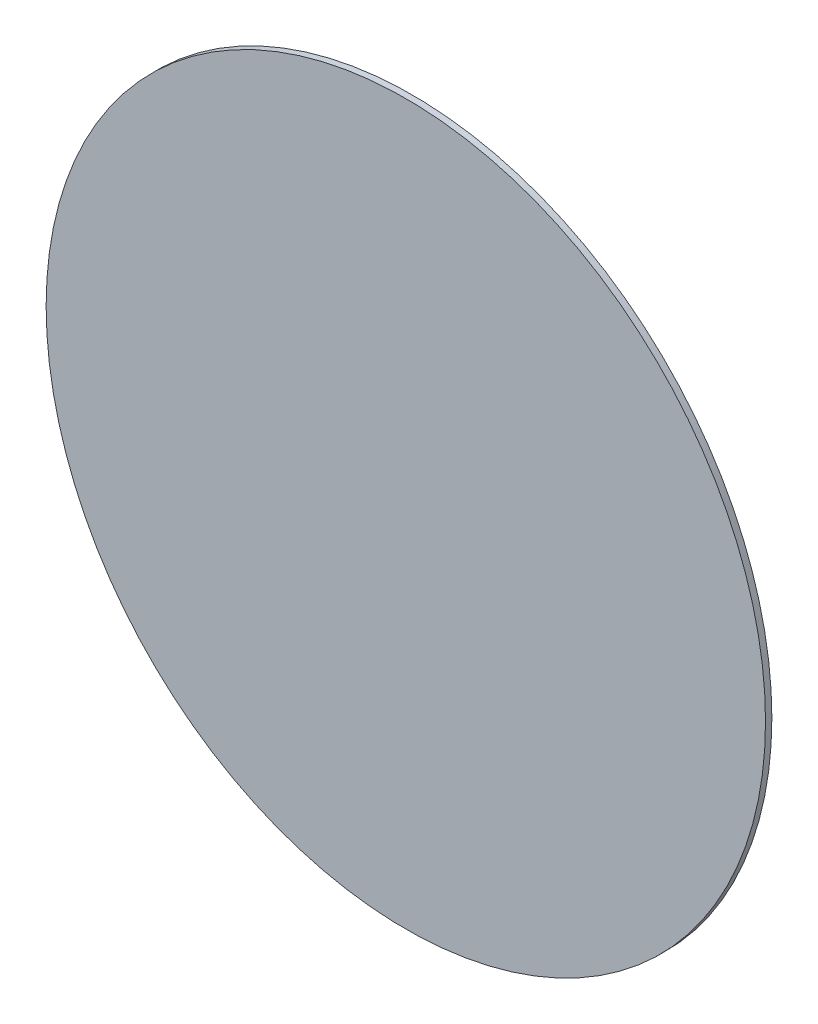
ISO-10303-21;
HEADER;
FILE_DESCRIPTION(('STEP AP214'),'2;1');
FILE_NAME('part.step','',(''),(''),'','','');
FILE_SCHEMA(('AUTOMOTIVE_DESIGN { 1 0 10303 214 1 1 1 1 }'));
ENDSEC;
DATA;
#1=APPLICATION_CONTEXT('core data for automotive mechanical design processes');
#2=APPLICATION_PROTOCOL_DEFINITION('international standard','automotive_design',2000,#1);
#3=PRODUCT_CONTEXT('',#1,'mechanical');
#4=PRODUCT('Part','Part','',(#3));
#5=PRODUCT_RELATED_PRODUCT_CATEGORY('part','',(#4));
#6=PRODUCT_DEFINITION_FORMATION('','',#4);
#7=PRODUCT_DEFINITION_CONTEXT('part definition',#1,'design');
#8=PRODUCT_DEFINITION('design','',#6,#7);
#9=PRODUCT_DEFINITION_SHAPE('','',#8);
#10=(LENGTH_UNIT() NAMED_UNIT(*) SI_UNIT(.MILLI.,.METRE.));
#11=(NAMED_UNIT(*) PLANE_ANGLE_UNIT() SI_UNIT($,.RADIAN.));
#12=(NAMED_UNIT(*) SI_UNIT($,.STERADIAN.) SOLID_ANGLE_UNIT());
#13=UNCERTAINTY_MEASURE_WITH_UNIT(LENGTH_MEASURE(1.E-05),#10,'distance_accuracy_value','');
#14=(GEOMETRIC_REPRESENTATION_CONTEXT(3) GLOBAL_UNCERTAINTY_ASSIGNED_CONTEXT((#13)) GLOBAL_UNIT_ASSIGNED_CONTEXT((#10,
#11,#12)) REPRESENTATION_CONTEXT('',''));
#15=CARTESIAN_POINT('',(0.,0.,0.));
#16=DIRECTION('',(0.,0.,1.));
#17=DIRECTION('',(1.,0.,0.));
#18=AXIS2_PLACEMENT_3D('',#15,#16,#17);
#19=CARTESIAN_POINT('',(-74.4148621736569,-31.383399440464,2.));
#20=DIRECTION('',(0.,0.,-1.));
#21=DIRECTION('',(-1.,0.,0.));
#22=AXIS2_PLACEMENT_3D('',#19,#20,#21);
#23=CYLINDRICAL_SURFACE('',#22,113.336684476096);
#24=CARTESIAN_POINT('',(-74.4148621736569,-31.383399440464,2.));
#25=DIRECTION('',(0.,0.,1.));
#26=DIRECTION('',(1.,0.,0.));
#27=AXIS2_PLACEMENT_3D('',#24,#25,#26);
#28=CIRCLE('',#27,113.336684476096);
#29=CARTESIAN_POINT('',(38.9218223024394,-31.383399440464,2.));
#30=VERTEX_POINT('',#29);
#31=EDGE_CURVE('E10',#30,#30,#28,.T.);
#32=ORIENTED_EDGE('',*,*,#31,.F.);
#33=EDGE_LOOP('',(#32));
#34=FACE_BOUND('',#33,.T.);
#35=CARTESIAN_POINT('',(-74.4148621736569,-31.383399440464,0.));
#36=DIRECTION('',(0.,0.,1.));
#37=DIRECTION('',(1.,0.,0.));
#38=AXIS2_PLACEMENT_3D('',#35,#36,#37);
#39=CIRCLE('',#38,113.336684476096);
#40=CARTESIAN_POINT('',(38.9218223024394,-31.383399440464,0.));
#41=VERTEX_POINT('',#40);
#42=EDGE_CURVE('E34',#41,#41,#39,.T.);
#43=ORIENTED_EDGE('',*,*,#42,.T.);
#44=EDGE_LOOP('',(#43));
#45=FACE_BOUND('',#44,.T.);
#46=ADVANCED_FACE('F31',(#34,#45),#23,.T.);
#47=CARTESIAN_POINT('',(-74.4148621736569,-31.383399440464,2.));
#48=DIRECTION('',(0.,0.,1.));
#49=DIRECTION('',(1.,0.,0.));
#50=AXIS2_PLACEMENT_3D('',#47,#48,#49);
#51=PLANE('',#50);
#52=ORIENTED_EDGE('',*,*,#31,.T.);
#53=EDGE_LOOP('',(#52));
#54=FACE_BOUND('',#53,.T.);
#55=ADVANCED_FACE('F46',(#54),#51,.T.);
#56=CARTESIAN_POINT('',(-74.4148621736569,-31.383399440464,0.));
#57=DIRECTION('',(0.,0.,1.));
#58=DIRECTION('',(1.,0.,0.));
#59=AXIS2_PLACEMENT_3D('',#56,#57,#58);
#60=PLANE('',#59);
#61=ORIENTED_EDGE('',*,*,#42,.F.);
#62=EDGE_LOOP('',(#61));
#63=FACE_BOUND('',#62,.T.);
#64=ADVANCED_FACE('F44',(#63),#60,.F.);
#65=CLOSED_SHELL('',(#46,#55,#64));
#66=MANIFOLD_SOLID_BREP('B2',#65);
#67=ADVANCED_BREP_SHAPE_REPRESENTATION('',(#18,#66),#14);
#68=SHAPE_DEFINITION_REPRESENTATION(#9,#67);
ENDSEC;
END-ISO-10303-21;
